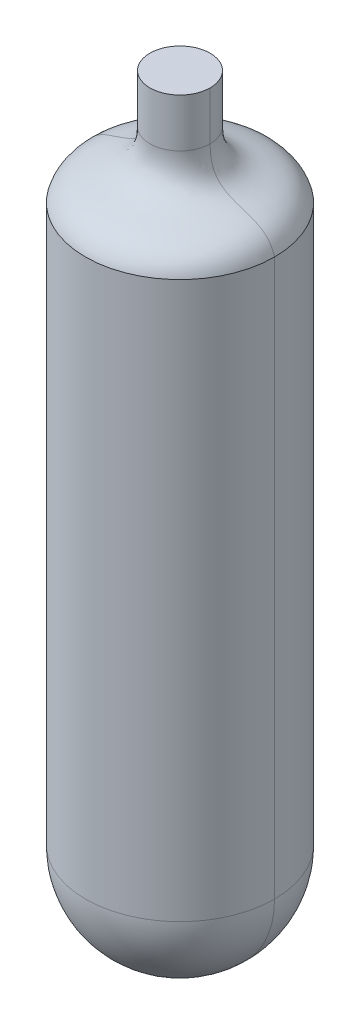
ISO-10303-21;
HEADER;
FILE_DESCRIPTION(('STEP AP214'),'2;1');
FILE_NAME('part.step','',(''),(''),'','','');
FILE_SCHEMA(('AUTOMOTIVE_DESIGN { 1 0 10303 214 1 1 1 1 }'));
ENDSEC;
DATA;
#1=APPLICATION_CONTEXT('core data for automotive mechanical design processes');
#2=APPLICATION_PROTOCOL_DEFINITION('international standard','automotive_design',2000,#1);
#3=PRODUCT_CONTEXT('',#1,'mechanical');
#4=PRODUCT('Part','Part','',(#3));
#5=PRODUCT_RELATED_PRODUCT_CATEGORY('part','',(#4));
#6=PRODUCT_DEFINITION_FORMATION('','',#4);
#7=PRODUCT_DEFINITION_CONTEXT('part definition',#1,'design');
#8=PRODUCT_DEFINITION('design','',#6,#7);
#9=PRODUCT_DEFINITION_SHAPE('','',#8);
#10=(LENGTH_UNIT() NAMED_UNIT(*) SI_UNIT(.MILLI.,.METRE.));
#11=(NAMED_UNIT(*) PLANE_ANGLE_UNIT() SI_UNIT($,.RADIAN.));
#12=(NAMED_UNIT(*) SI_UNIT($,.STERADIAN.) SOLID_ANGLE_UNIT());
#13=UNCERTAINTY_MEASURE_WITH_UNIT(LENGTH_MEASURE(1.E-05),#10,'distance_accuracy_value','');
#14=(GEOMETRIC_REPRESENTATION_CONTEXT(3) GLOBAL_UNCERTAINTY_ASSIGNED_CONTEXT((#13)) GLOBAL_UNIT_ASSIGNED_CONTEXT((#10,
#11,#12)) REPRESENTATION_CONTEXT('',''));
#15=CARTESIAN_POINT('',(0.,0.,0.));
#16=DIRECTION('',(0.,0.,1.));
#17=DIRECTION('',(1.,0.,0.));
#18=AXIS2_PLACEMENT_3D('',#15,#16,#17);
#19=CARTESIAN_POINT('',(0.,28.,0.));
#20=DIRECTION('',(0.,1.,0.));
#21=DIRECTION('',(-1.,0.,0.));
#22=AXIS2_PLACEMENT_3D('',#19,#20,#21);
#23=CYLINDRICAL_SURFACE('',#22,11.);
#24=DIRECTION('',(0.,1.,0.));
#25=VECTOR('',#24,1.);
#26=CARTESIAN_POINT('',(11.,28.,0.));
#27=LINE('',#26,#25);
#28=CARTESIAN_POINT('',(11.,-28.,0.));
#29=VERTEX_POINT('',#28);
#30=CARTESIAN_POINT('',(11.,36.7061899039136,0.));
#31=VERTEX_POINT('',#30);
#32=EDGE_CURVE('E115',#29,#31,#27,.T.);
#33=ORIENTED_EDGE('',*,*,#32,.F.);
#34=CARTESIAN_POINT('',(0.,-28.,0.));
#35=DIRECTION('',(0.,1.,0.));
#36=DIRECTION('',(-1.,0.,0.));
#37=AXIS2_PLACEMENT_3D('',#34,#35,#36);
#38=CIRCLE('',#37,11.);
#39=CARTESIAN_POINT('',(-11.,-28.,0.));
#40=VERTEX_POINT('',#39);
#41=EDGE_CURVE('E11',#29,#40,#38,.T.);
#42=ORIENTED_EDGE('',*,*,#41,.T.);
#43=DIRECTION('',(0.,1.,0.));
#44=VECTOR('',#43,1.);
#45=CARTESIAN_POINT('',(-11.,28.,0.));
#46=LINE('',#45,#44);
#47=CARTESIAN_POINT('',(-11.,36.7061899039136,0.));
#48=VERTEX_POINT('',#47);
#49=EDGE_CURVE('E119',#40,#48,#46,.T.);
#50=ORIENTED_EDGE('',*,*,#49,.T.);
#51=CARTESIAN_POINT('',(0.,36.7061899039136,0.));
#52=DIRECTION('',(0.,1.,0.));
#53=DIRECTION('',(-1.,0.,0.));
#54=AXIS2_PLACEMENT_3D('',#51,#52,#53);
#55=CIRCLE('',#54,11.);
#56=EDGE_CURVE('E87',#31,#48,#55,.T.);
#57=ORIENTED_EDGE('',*,*,#56,.F.);
#58=EDGE_LOOP('',(#33,#42,#50,#57));
#59=FACE_BOUND('',#58,.T.);
#60=ADVANCED_FACE('F16',(#59),#23,.T.);
#61=CARTESIAN_POINT('',(0.,-28.,0.));
#62=DIRECTION('',(0.,0.,1.));
#63=DIRECTION('',(-1.,0.,0.));
#64=AXIS2_PLACEMENT_3D('',#61,#62,#63);
#65=SPHERICAL_SURFACE('',#64,11.);
#66=CARTESIAN_POINT('',(0.,-28.,0.));
#67=DIRECTION('',(0.,0.,1.));
#68=DIRECTION('',(1.,0.,0.));
#69=AXIS2_PLACEMENT_3D('',#66,#67,#68);
#70=CIRCLE('',#69,11.);
#71=CARTESIAN_POINT('',(0.,-39.,0.));
#72=VERTEX_POINT('',#71);
#73=EDGE_CURVE('E134',#72,#29,#70,.T.);
#74=ORIENTED_EDGE('',*,*,#73,.F.);
#75=CARTESIAN_POINT('',(0.,-28.,0.));
#76=DIRECTION('',(0.,0.,-1.));
#77=DIRECTION('',(-1.,0.,0.));
#78=AXIS2_PLACEMENT_3D('',#75,#76,#77);
#79=CIRCLE('',#78,11.);
#80=EDGE_CURVE('E130',#72,#40,#79,.T.);
#81=ORIENTED_EDGE('',*,*,#80,.T.);
#82=ORIENTED_EDGE('',*,*,#41,.F.);
#83=EDGE_LOOP('',(#74,#81,#82));
#84=FACE_BOUND('',#83,.T.);
#85=ADVANCED_FACE('F237',(#84),#65,.T.);
#86=CARTESIAN_POINT('',(2.97381167310311E-13,50.,0.));
#87=DIRECTION('',(0.,-1.,0.));
#88=DIRECTION('',(0.,0.,-1.));
#89=AXIS2_PLACEMENT_3D('',#86,#87,#88);
#90=PLANE('',#89);
#91=CARTESIAN_POINT('',(0.,50.,0.));
#92=DIRECTION('',(0.,1.,0.));
#93=DIRECTION('',(-1.,0.,0.));
#94=AXIS2_PLACEMENT_3D('',#91,#92,#93);
#95=CIRCLE('',#94,3.5);
#96=CARTESIAN_POINT('',(-3.5,50.,0.));
#97=VERTEX_POINT('',#96);
#98=CARTESIAN_POINT('',(3.5,50.,0.));
#99=VERTEX_POINT('',#98);
#100=EDGE_CURVE('E94',#97,#99,#95,.T.);
#101=ORIENTED_EDGE('',*,*,#100,.T.);
#102=CARTESIAN_POINT('',(0.,50.,0.));
#103=DIRECTION('',(0.,1.,0.));
#104=DIRECTION('',(-1.,0.,0.));
#105=AXIS2_PLACEMENT_3D('',#102,#103,#104);
#106=CIRCLE('',#105,3.5);
#107=EDGE_CURVE('E29',#99,#97,#106,.T.);
#108=ORIENTED_EDGE('',*,*,#107,.T.);
#109=EDGE_LOOP('',(#101,#108));
#110=FACE_BOUND('',#109,.T.);
#111=ADVANCED_FACE('F233',(#110),#90,.F.);
#112=CARTESIAN_POINT('',(0.,28.,0.));
#113=DIRECTION('',(0.,1.,0.));
#114=DIRECTION('',(-1.,0.,0.));
#115=AXIS2_PLACEMENT_3D('',#112,#113,#114);
#116=CYLINDRICAL_SURFACE('',#115,3.5);
#117=DIRECTION('',(0.,1.,0.));
#118=VECTOR('',#117,1.);
#119=CARTESIAN_POINT('',(3.5,28.,0.));
#120=LINE('',#119,#118);
#121=CARTESIAN_POINT('',(3.5,44.3643877920503,0.));
#122=VERTEX_POINT('',#121);
#123=EDGE_CURVE('E84',#122,#99,#120,.T.);
#124=ORIENTED_EDGE('',*,*,#123,.F.);
#125=CARTESIAN_POINT('',(0.,44.3643877920503,0.));
#126=DIRECTION('',(0.,1.,0.));
#127=DIRECTION('',(-1.,0.,0.));
#128=AXIS2_PLACEMENT_3D('',#125,#126,#127);
#129=CIRCLE('',#128,3.5);
#130=CARTESIAN_POINT('',(-3.5,44.3643877920503,0.));
#131=VERTEX_POINT('',#130);
#132=EDGE_CURVE('E72',#122,#131,#129,.T.);
#133=ORIENTED_EDGE('',*,*,#132,.T.);
#134=DIRECTION('',(0.,1.,0.));
#135=VECTOR('',#134,1.);
#136=CARTESIAN_POINT('',(-3.5,28.,0.));
#137=LINE('',#136,#135);
#138=EDGE_CURVE('E81',#131,#97,#137,.T.);
#139=ORIENTED_EDGE('',*,*,#138,.T.);
#140=ORIENTED_EDGE('',*,*,#107,.F.);
#141=EDGE_LOOP('',(#124,#133,#139,#140));
#142=FACE_BOUND('',#141,.T.);
#143=ADVANCED_FACE('F80',(#142),#116,.T.);
#144=CARTESIAN_POINT('',(3.5,44.3643877920503,0.));
#145=CARTESIAN_POINT('',(3.49999999999999,44.3643877920503,-6.99999999999999));
#146=CARTESIAN_POINT('',(-3.49999999999999,44.3643877920503,-6.99999999999999));
#147=CARTESIAN_POINT('',(-3.5,44.3643877920503,0.));
#148=CARTESIAN_POINT('',(3.40191544216591,38.2169727225151,0.));
#149=CARTESIAN_POINT('',(3.4019154421659,38.216972722515,-6.80383088433181));
#150=CARTESIAN_POINT('',(-3.4019154421659,38.216972722515,-6.80383088433181));
#151=CARTESIAN_POINT('',(-3.40191544216591,38.2169727225151,0.));
#152=CARTESIAN_POINT('',(9.7943354999844,41.0726981040417,0.));
#153=CARTESIAN_POINT('',(9.7943354999844,41.0726981040417,-19.5886709999688));
#154=CARTESIAN_POINT('',(-9.7943354999844,41.0726981040417,-19.5886709999688));
#155=CARTESIAN_POINT('',(-9.7943354999844,41.0726981040417,0.));
#156=CARTESIAN_POINT('',(11.,36.7061899039136,0.));
#157=CARTESIAN_POINT('',(11.,36.7061899039137,-22.));
#158=CARTESIAN_POINT('',(-11.,36.7061899039137,-22.));
#159=CARTESIAN_POINT('',(-11.,36.7061899039136,0.));
#160=(BOUNDED_SURFACE() B_SPLINE_SURFACE(3,3,((#144,#145,#146,#147),(#148,#149,#150,#151),(#152,
#153,#154,#155),(#156,#157,#158,#159)),.UNSPECIFIED.,.F.,.F.,
.F.) B_SPLINE_SURFACE_WITH_KNOTS((4,4),(4,4),(0.,1.),(0.,1.),
.UNSPECIFIED.) GEOMETRIC_REPRESENTATION_ITEM() RATIONAL_B_SPLINE_SURFACE(((1.,0.333333333333334,
0.333333333333334,1.),(1.,0.333333333333334,0.333333333333334,1.),(1.,0.333333333333334,
0.333333333333334,1.),(1.,0.333333333333334,0.333333333333334,1.))) REPRESENTATION_ITEM('') SURFACE());
#161=CARTESIAN_POINT('',(-3.5,44.3643877920503,0.));
#162=CARTESIAN_POINT('',(-3.40191544216591,38.2169727225151,0.));
#163=CARTESIAN_POINT('',(-9.7943354999844,41.0726981040417,0.));
#164=CARTESIAN_POINT('',(-11.,36.7061899039136,0.));
#165=(BOUNDED_CURVE() B_SPLINE_CURVE(3,(#161,#162,#163,#164),.UNSPECIFIED.,.F.,
.F.) B_SPLINE_CURVE_WITH_KNOTS((4,4),(0.,1.),
.UNSPECIFIED.) CURVE() GEOMETRIC_REPRESENTATION_ITEM() RATIONAL_B_SPLINE_CURVE((1.,1.,1.,1.)) REPRESENTATION_ITEM(''));
#166=EDGE_CURVE('E98',#131,#48,#165,.T.);
#167=CARTESIAN_POINT('',(3.5,44.3643877920503,0.));
#168=CARTESIAN_POINT('',(3.40191544216591,38.2169727225151,0.));
#169=CARTESIAN_POINT('',(9.7943354999844,41.0726981040417,0.));
#170=CARTESIAN_POINT('',(11.,36.7061899039136,0.));
#171=(BOUNDED_CURVE() B_SPLINE_CURVE(3,(#167,#168,#169,#170),.UNSPECIFIED.,.F.,
.F.) B_SPLINE_CURVE_WITH_KNOTS((4,4),(0.,1.),
.UNSPECIFIED.) CURVE() GEOMETRIC_REPRESENTATION_ITEM() RATIONAL_B_SPLINE_CURVE((1.,1.,1.,1.)) REPRESENTATION_ITEM(''));
#172=EDGE_CURVE('E106',#122,#31,#171,.T.);
#173=ORIENTED_EDGE('',*,*,#166,.F.);
#174=ORIENTED_EDGE('',*,*,#132,.F.);
#175=ORIENTED_EDGE('',*,*,#172,.T.);
#176=ORIENTED_EDGE('',*,*,#56,.T.);
#177=EDGE_LOOP('',(#173,#174,#175,#176));
#178=FACE_BOUND('',#177,.T.);
#179=ADVANCED_FACE('F99',(#178),#160,.T.);
#180=CARTESIAN_POINT('',(0.,28.,0.));
#181=DIRECTION('',(0.,1.,0.));
#182=DIRECTION('',(-1.,0.,0.));
#183=AXIS2_PLACEMENT_3D('',#180,#181,#182);
#184=CYLINDRICAL_SURFACE('',#183,3.5);
#185=CARTESIAN_POINT('',(0.,44.3643877920503,0.));
#186=DIRECTION('',(0.,1.,0.));
#187=DIRECTION('',(-1.,0.,0.));
#188=AXIS2_PLACEMENT_3D('',#185,#186,#187);
#189=CIRCLE('',#188,3.5);
#190=EDGE_CURVE('E93',#131,#122,#189,.T.);
#191=ORIENTED_EDGE('',*,*,#190,.T.);
#192=ORIENTED_EDGE('',*,*,#123,.T.);
#193=ORIENTED_EDGE('',*,*,#100,.F.);
#194=ORIENTED_EDGE('',*,*,#138,.F.);
#195=EDGE_LOOP('',(#191,#192,#193,#194));
#196=FACE_BOUND('',#195,.T.);
#197=ADVANCED_FACE('F91',(#196),#184,.T.);
#198=CARTESIAN_POINT('',(0.,-28.,0.));
#199=DIRECTION('',(0.,0.,1.));
#200=DIRECTION('',(-1.,0.,0.));
#201=AXIS2_PLACEMENT_3D('',#198,#199,#200);
#202=SPHERICAL_SURFACE('',#201,11.);
#203=ORIENTED_EDGE('',*,*,#80,.F.);
#204=ORIENTED_EDGE('',*,*,#73,.T.);
#205=CARTESIAN_POINT('',(0.,-28.,0.));
#206=DIRECTION('',(0.,1.,0.));
#207=DIRECTION('',(-1.,0.,0.));
#208=AXIS2_PLACEMENT_3D('',#205,#206,#207);
#209=CIRCLE('',#208,11.);
#210=EDGE_CURVE('E22',#40,#29,#209,.T.);
#211=ORIENTED_EDGE('',*,*,#210,.F.);
#212=EDGE_LOOP('',(#203,#204,#211));
#213=FACE_BOUND('',#212,.T.);
#214=ADVANCED_FACE('F228',(#213),#202,.T.);
#215=CARTESIAN_POINT('',(0.,28.,0.));
#216=DIRECTION('',(0.,1.,0.));
#217=DIRECTION('',(-1.,0.,0.));
#218=AXIS2_PLACEMENT_3D('',#215,#216,#217);
#219=CYLINDRICAL_SURFACE('',#218,11.);
#220=ORIENTED_EDGE('',*,*,#210,.T.);
#221=ORIENTED_EDGE('',*,*,#32,.T.);
#222=CARTESIAN_POINT('',(0.,36.7061899039136,0.));
#223=DIRECTION('',(0.,1.,0.));
#224=DIRECTION('',(-1.,0.,0.));
#225=AXIS2_PLACEMENT_3D('',#222,#223,#224);
#226=CIRCLE('',#225,11.);
#227=EDGE_CURVE('E104',#48,#31,#226,.T.);
#228=ORIENTED_EDGE('',*,*,#227,.F.);
#229=ORIENTED_EDGE('',*,*,#49,.F.);
#230=EDGE_LOOP('',(#220,#221,#228,#229));
#231=FACE_BOUND('',#230,.T.);
#232=ADVANCED_FACE('F156',(#231),#219,.T.);
#233=CARTESIAN_POINT('',(-3.5,44.3643877920503,0.));
#234=CARTESIAN_POINT('',(-3.49999999999999,44.3643877920503,6.99999999999999));
#235=CARTESIAN_POINT('',(3.49999999999999,44.3643877920503,6.99999999999999));
#236=CARTESIAN_POINT('',(3.5,44.3643877920503,0.));
#237=CARTESIAN_POINT('',(-3.40191544216591,38.2169727225151,0.));
#238=CARTESIAN_POINT('',(-3.4019154421659,38.216972722515,6.80383088433181));
#239=CARTESIAN_POINT('',(3.4019154421659,38.216972722515,6.80383088433181));
#240=CARTESIAN_POINT('',(3.40191544216591,38.2169727225151,0.));
#241=CARTESIAN_POINT('',(-9.7943354999844,41.0726981040417,0.));
#242=CARTESIAN_POINT('',(-9.7943354999844,41.0726981040417,19.5886709999688));
#243=CARTESIAN_POINT('',(9.7943354999844,41.0726981040417,19.5886709999688));
#244=CARTESIAN_POINT('',(9.7943354999844,41.0726981040417,0.));
#245=CARTESIAN_POINT('',(-11.,36.7061899039136,0.));
#246=CARTESIAN_POINT('',(-11.,36.7061899039137,22.));
#247=CARTESIAN_POINT('',(11.,36.7061899039137,22.));
#248=CARTESIAN_POINT('',(11.,36.7061899039136,0.));
#249=(BOUNDED_SURFACE() B_SPLINE_SURFACE(3,3,((#233,#234,#235,#236),(#237,#238,#239,#240),(#241,
#242,#243,#244),(#245,#246,#247,#248)),.UNSPECIFIED.,.F.,.F.,
.F.) B_SPLINE_SURFACE_WITH_KNOTS((4,4),(4,4),(0.,1.),(0.,1.),
.UNSPECIFIED.) GEOMETRIC_REPRESENTATION_ITEM() RATIONAL_B_SPLINE_SURFACE(((1.,0.333333333333334,
0.333333333333334,1.),(1.,0.333333333333334,0.333333333333334,1.),(1.,0.333333333333334,
0.333333333333334,1.),(1.,0.333333333333334,0.333333333333334,1.))) REPRESENTATION_ITEM('') SURFACE());
#250=ORIENTED_EDGE('',*,*,#190,.F.);
#251=ORIENTED_EDGE('',*,*,#166,.T.);
#252=ORIENTED_EDGE('',*,*,#227,.T.);
#253=ORIENTED_EDGE('',*,*,#172,.F.);
#254=EDGE_LOOP('',(#250,#251,#252,#253));
#255=FACE_BOUND('',#254,.T.);
#256=ADVANCED_FACE('F18',(#255),#249,.T.);
#257=CLOSED_SHELL('',(#60,#85,#111,#143,#179,#197,#214,#232,#256));
#258=MANIFOLD_SOLID_BREP('B1',#257);
#259=ADVANCED_BREP_SHAPE_REPRESENTATION('',(#18,#258),#14);
#260=SHAPE_DEFINITION_REPRESENTATION(#9,#259);
ENDSEC;
END-ISO-10303-21;
